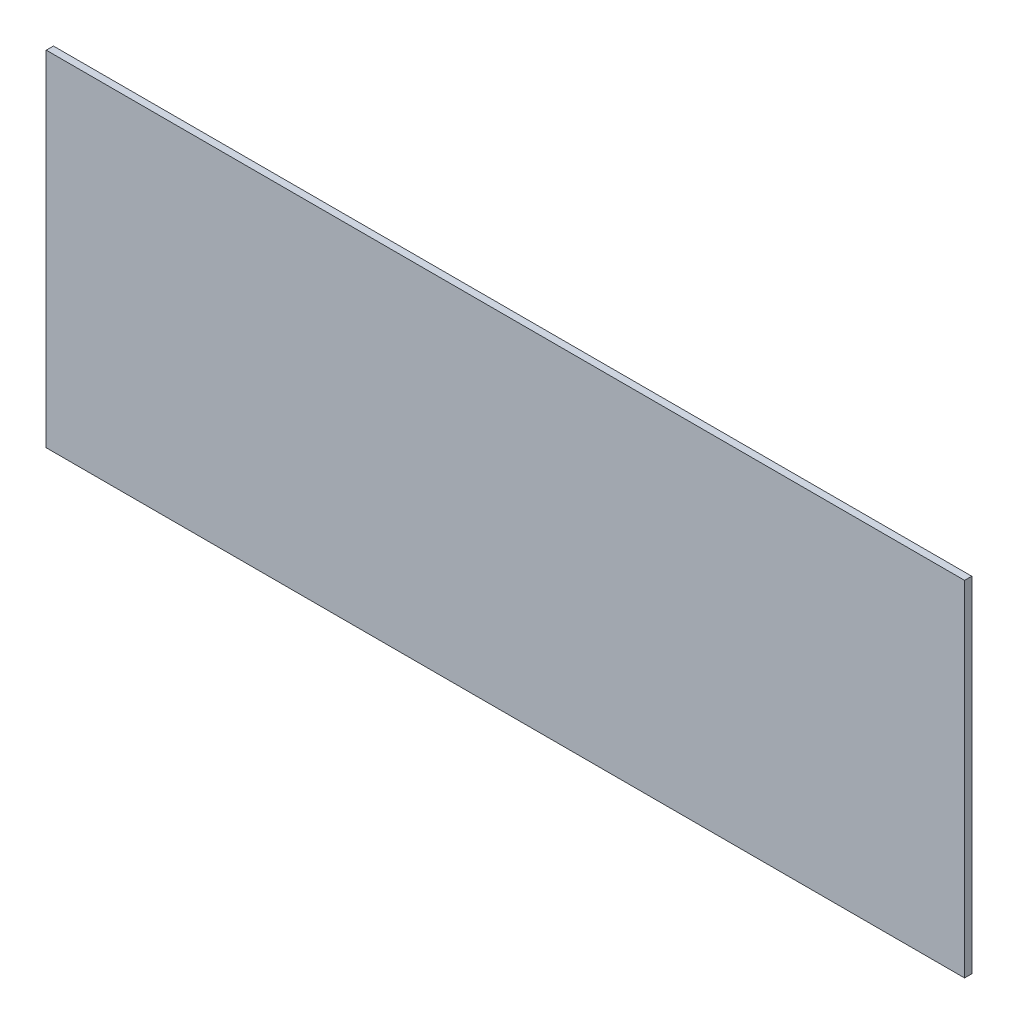
ISO-10303-21;
HEADER;
FILE_DESCRIPTION(('STEP AP214'),'2;1');
FILE_NAME('part.step','',(''),(''),'','','');
FILE_SCHEMA(('AUTOMOTIVE_DESIGN { 1 0 10303 214 1 1 1 1 }'));
ENDSEC;
DATA;
#1=APPLICATION_CONTEXT('core data for automotive mechanical design processes');
#2=APPLICATION_PROTOCOL_DEFINITION('international standard','automotive_design',2000,#1);
#3=PRODUCT_CONTEXT('',#1,'mechanical');
#4=PRODUCT('Part','Part','',(#3));
#5=PRODUCT_RELATED_PRODUCT_CATEGORY('part','',(#4));
#6=PRODUCT_DEFINITION_FORMATION('','',#4);
#7=PRODUCT_DEFINITION_CONTEXT('part definition',#1,'design');
#8=PRODUCT_DEFINITION('design','',#6,#7);
#9=PRODUCT_DEFINITION_SHAPE('','',#8);
#10=(LENGTH_UNIT() NAMED_UNIT(*) SI_UNIT(.MILLI.,.METRE.));
#11=(NAMED_UNIT(*) PLANE_ANGLE_UNIT() SI_UNIT($,.RADIAN.));
#12=(NAMED_UNIT(*) SI_UNIT($,.STERADIAN.) SOLID_ANGLE_UNIT());
#13=UNCERTAINTY_MEASURE_WITH_UNIT(LENGTH_MEASURE(1.E-05),#10,'distance_accuracy_value','');
#14=(GEOMETRIC_REPRESENTATION_CONTEXT(3) GLOBAL_UNCERTAINTY_ASSIGNED_CONTEXT((#13)) GLOBAL_UNIT_ASSIGNED_CONTEXT((#10,
#11,#12)) REPRESENTATION_CONTEXT('',''));
#15=CARTESIAN_POINT('',(0.,0.,0.));
#16=DIRECTION('',(0.,0.,1.));
#17=DIRECTION('',(1.,0.,0.));
#18=AXIS2_PLACEMENT_3D('',#15,#16,#17);
#19=CARTESIAN_POINT('',(0.,0.,19.05));
#20=DIRECTION('',(1.,0.,0.));
#21=DIRECTION('',(0.,0.,-1.));
#22=AXIS2_PLACEMENT_3D('',#19,#20,#21);
#23=PLANE('',#22);
#24=DIRECTION('',(0.,-1.,0.));
#25=VECTOR('',#24,1.);
#26=CARTESIAN_POINT('',(0.,0.,0.));
#27=LINE('',#26,#25);
#28=CARTESIAN_POINT('',(0.,914.4,0.));
#29=VERTEX_POINT('',#28);
#30=CARTESIAN_POINT('',(0.,0.,0.));
#31=VERTEX_POINT('',#30);
#32=EDGE_CURVE('E97',#29,#31,#27,.T.);
#33=ORIENTED_EDGE('',*,*,#32,.T.);
#34=DIRECTION('',(0.,0.,-1.));
#35=VECTOR('',#34,1.);
#36=CARTESIAN_POINT('',(0.,0.,19.05));
#37=LINE('',#36,#35);
#38=CARTESIAN_POINT('',(0.,0.,19.05));
#39=VERTEX_POINT('',#38);
#40=EDGE_CURVE('E11',#39,#31,#37,.T.);
#41=ORIENTED_EDGE('',*,*,#40,.F.);
#42=DIRECTION('',(0.,-1.,0.));
#43=VECTOR('',#42,1.);
#44=CARTESIAN_POINT('',(0.,0.,19.05));
#45=LINE('',#44,#43);
#46=CARTESIAN_POINT('',(0.,914.4,19.05));
#47=VERTEX_POINT('',#46);
#48=EDGE_CURVE('E85',#47,#39,#45,.T.);
#49=ORIENTED_EDGE('',*,*,#48,.F.);
#50=DIRECTION('',(0.,0.,-1.));
#51=VECTOR('',#50,1.);
#52=CARTESIAN_POINT('',(0.,914.4,19.05));
#53=LINE('',#52,#51);
#54=EDGE_CURVE('E93',#47,#29,#53,.T.);
#55=ORIENTED_EDGE('',*,*,#54,.T.);
#56=EDGE_LOOP('',(#33,#41,#49,#55));
#57=FACE_BOUND('',#56,.T.);
#58=ADVANCED_FACE('F34',(#57),#23,.F.);
#59=CARTESIAN_POINT('',(0.,0.,19.05));
#60=DIRECTION('',(0.,1.,0.));
#61=DIRECTION('',(0.,0.,1.));
#62=AXIS2_PLACEMENT_3D('',#59,#60,#61);
#63=PLANE('',#62);
#64=DIRECTION('',(1.,0.,0.));
#65=VECTOR('',#64,1.);
#66=CARTESIAN_POINT('',(0.,0.,0.));
#67=LINE('',#66,#65);
#68=CARTESIAN_POINT('',(2438.4,0.,0.));
#69=VERTEX_POINT('',#68);
#70=EDGE_CURVE('E89',#31,#69,#67,.T.);
#71=ORIENTED_EDGE('',*,*,#70,.T.);
#72=DIRECTION('',(0.,0.,-1.));
#73=VECTOR('',#72,1.);
#74=CARTESIAN_POINT('',(2438.4,0.,19.05));
#75=LINE('',#74,#73);
#76=CARTESIAN_POINT('',(2438.4,0.,19.05));
#77=VERTEX_POINT('',#76);
#78=EDGE_CURVE('E42',#77,#69,#75,.T.);
#79=ORIENTED_EDGE('',*,*,#78,.F.);
#80=DIRECTION('',(1.,0.,0.));
#81=VECTOR('',#80,1.);
#82=CARTESIAN_POINT('',(0.,0.,19.05));
#83=LINE('',#82,#81);
#84=EDGE_CURVE('E80',#39,#77,#83,.T.);
#85=ORIENTED_EDGE('',*,*,#84,.F.);
#86=ORIENTED_EDGE('',*,*,#40,.T.);
#87=EDGE_LOOP('',(#71,#79,#85,#86));
#88=FACE_BOUND('',#87,.T.);
#89=ADVANCED_FACE('F88',(#88),#63,.F.);
#90=CARTESIAN_POINT('',(2438.4,0.,19.05));
#91=DIRECTION('',(-1.,0.,0.));
#92=DIRECTION('',(0.,0.,1.));
#93=AXIS2_PLACEMENT_3D('',#90,#91,#92);
#94=PLANE('',#93);
#95=DIRECTION('',(0.,1.,0.));
#96=VECTOR('',#95,1.);
#97=CARTESIAN_POINT('',(2438.4,0.,0.));
#98=LINE('',#97,#96);
#99=CARTESIAN_POINT('',(2438.4,914.4,0.));
#100=VERTEX_POINT('',#99);
#101=EDGE_CURVE('E67',#69,#100,#98,.T.);
#102=ORIENTED_EDGE('',*,*,#101,.T.);
#103=DIRECTION('',(0.,0.,-1.));
#104=VECTOR('',#103,1.);
#105=CARTESIAN_POINT('',(2438.4,914.4,19.05));
#106=LINE('',#105,#104);
#107=CARTESIAN_POINT('',(2438.4,914.4,19.05));
#108=VERTEX_POINT('',#107);
#109=EDGE_CURVE('E90',#108,#100,#106,.T.);
#110=ORIENTED_EDGE('',*,*,#109,.F.);
#111=DIRECTION('',(0.,1.,0.));
#112=VECTOR('',#111,1.);
#113=CARTESIAN_POINT('',(2438.4,0.,19.05));
#114=LINE('',#113,#112);
#115=EDGE_CURVE('E83',#77,#108,#114,.T.);
#116=ORIENTED_EDGE('',*,*,#115,.F.);
#117=ORIENTED_EDGE('',*,*,#78,.T.);
#118=EDGE_LOOP('',(#102,#110,#116,#117));
#119=FACE_BOUND('',#118,.T.);
#120=ADVANCED_FACE('F91',(#119),#94,.F.);
#121=CARTESIAN_POINT('',(0.,914.4,19.05));
#122=DIRECTION('',(0.,-1.,0.));
#123=DIRECTION('',(0.,0.,-1.));
#124=AXIS2_PLACEMENT_3D('',#121,#122,#123);
#125=PLANE('',#124);
#126=DIRECTION('',(-1.,0.,0.));
#127=VECTOR('',#126,1.);
#128=CARTESIAN_POINT('',(0.,914.4,0.));
#129=LINE('',#128,#127);
#130=EDGE_CURVE('E73',#100,#29,#129,.T.);
#131=ORIENTED_EDGE('',*,*,#130,.T.);
#132=ORIENTED_EDGE('',*,*,#54,.F.);
#133=DIRECTION('',(-1.,0.,0.));
#134=VECTOR('',#133,1.);
#135=CARTESIAN_POINT('',(0.,914.4,19.05));
#136=LINE('',#135,#134);
#137=EDGE_CURVE('E50',#108,#47,#136,.T.);
#138=ORIENTED_EDGE('',*,*,#137,.F.);
#139=ORIENTED_EDGE('',*,*,#109,.T.);
#140=EDGE_LOOP('',(#131,#132,#138,#139));
#141=FACE_BOUND('',#140,.T.);
#142=ADVANCED_FACE('F104',(#141),#125,.F.);
#143=CARTESIAN_POINT('',(0.,0.,19.05));
#144=DIRECTION('',(0.,0.,-1.));
#145=DIRECTION('',(-1.,0.,0.));
#146=AXIS2_PLACEMENT_3D('',#143,#144,#145);
#147=PLANE('',#146);
#148=ORIENTED_EDGE('',*,*,#48,.T.);
#149=ORIENTED_EDGE('',*,*,#84,.T.);
#150=ORIENTED_EDGE('',*,*,#115,.T.);
#151=ORIENTED_EDGE('',*,*,#137,.T.);
#152=EDGE_LOOP('',(#148,#149,#150,#151));
#153=FACE_BOUND('',#152,.T.);
#154=ADVANCED_FACE('F81',(#153),#147,.F.);
#155=CARTESIAN_POINT('',(0.,0.,0.));
#156=DIRECTION('',(0.,0.,-1.));
#157=DIRECTION('',(-1.,0.,0.));
#158=AXIS2_PLACEMENT_3D('',#155,#156,#157);
#159=PLANE('',#158);
#160=ORIENTED_EDGE('',*,*,#32,.F.);
#161=ORIENTED_EDGE('',*,*,#130,.F.);
#162=ORIENTED_EDGE('',*,*,#101,.F.);
#163=ORIENTED_EDGE('',*,*,#70,.F.);
#164=EDGE_LOOP('',(#160,#161,#162,#163));
#165=FACE_BOUND('',#164,.T.);
#166=ADVANCED_FACE('F107',(#165),#159,.T.);
#167=CLOSED_SHELL('',(#58,#89,#120,#142,#154,#166));
#168=MANIFOLD_SOLID_BREP('B2',#167);
#169=ADVANCED_BREP_SHAPE_REPRESENTATION('',(#18,#168),#14);
#170=SHAPE_DEFINITION_REPRESENTATION(#9,#169);
ENDSEC;
END-ISO-10303-21;
